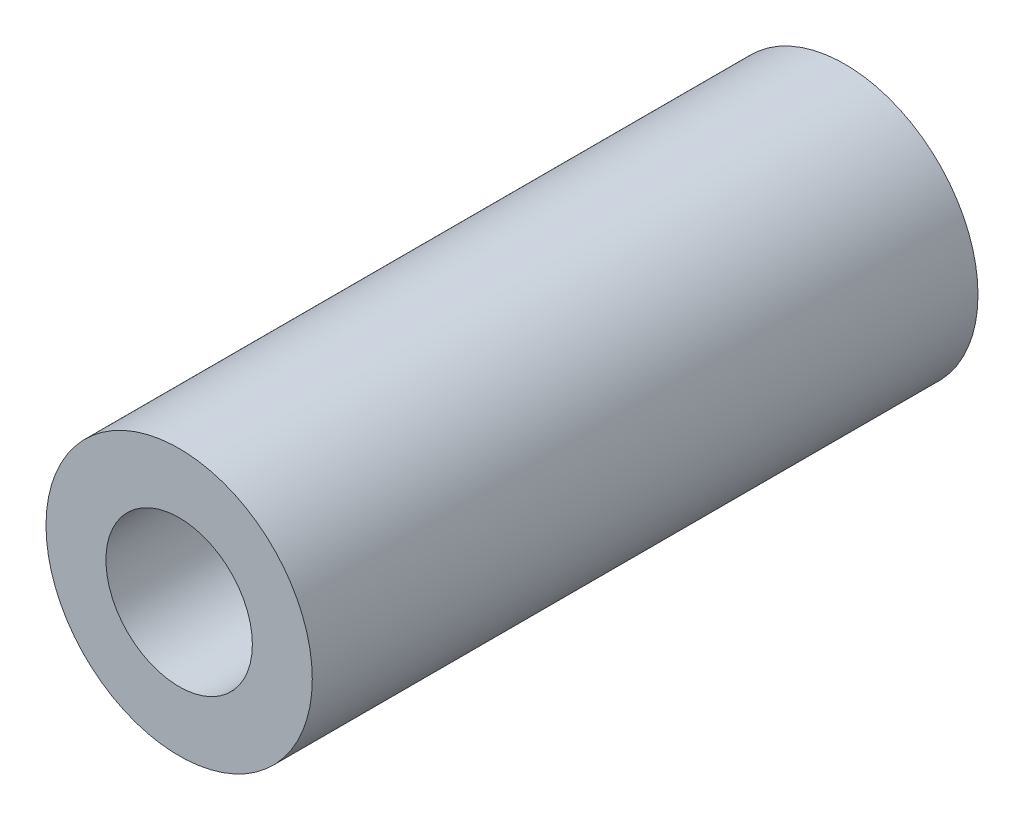
ISO-10303-21;
HEADER;
FILE_DESCRIPTION(('STEP AP214'),'2;1');
FILE_NAME('part.step','',(''),(''),'','','');
FILE_SCHEMA(('AUTOMOTIVE_DESIGN { 1 0 10303 214 1 1 1 1 }'));
ENDSEC;
DATA;
#1=APPLICATION_CONTEXT('core data for automotive mechanical design processes');
#2=APPLICATION_PROTOCOL_DEFINITION('international standard','automotive_design',2000,#1);
#3=PRODUCT_CONTEXT('',#1,'mechanical');
#4=PRODUCT('Part','Part','',(#3));
#5=PRODUCT_RELATED_PRODUCT_CATEGORY('part','',(#4));
#6=PRODUCT_DEFINITION_FORMATION('','',#4);
#7=PRODUCT_DEFINITION_CONTEXT('part definition',#1,'design');
#8=PRODUCT_DEFINITION('design','',#6,#7);
#9=PRODUCT_DEFINITION_SHAPE('','',#8);
#10=(LENGTH_UNIT() NAMED_UNIT(*) SI_UNIT(.MILLI.,.METRE.));
#11=(NAMED_UNIT(*) PLANE_ANGLE_UNIT() SI_UNIT($,.RADIAN.));
#12=(NAMED_UNIT(*) SI_UNIT($,.STERADIAN.) SOLID_ANGLE_UNIT());
#13=UNCERTAINTY_MEASURE_WITH_UNIT(LENGTH_MEASURE(1.E-05),#10,'distance_accuracy_value','');
#14=(GEOMETRIC_REPRESENTATION_CONTEXT(3) GLOBAL_UNCERTAINTY_ASSIGNED_CONTEXT((#13)) GLOBAL_UNIT_ASSIGNED_CONTEXT((#10,
#11,#12)) REPRESENTATION_CONTEXT('',''));
#15=CARTESIAN_POINT('',(0.,0.,0.));
#16=DIRECTION('',(0.,0.,1.));
#17=DIRECTION('',(1.,0.,0.));
#18=AXIS2_PLACEMENT_3D('',#15,#16,#17);
#19=CARTESIAN_POINT('',(0.,0.,10.));
#20=DIRECTION('',(0.,0.,1.));
#21=DIRECTION('',(1.,0.,0.));
#22=AXIS2_PLACEMENT_3D('',#19,#20,#21);
#23=PLANE('',#22);
#24=CARTESIAN_POINT('',(0.,0.,10.));
#25=DIRECTION('',(0.,0.,1.));
#26=DIRECTION('',(1.,0.,0.));
#27=AXIS2_PLACEMENT_3D('',#24,#25,#26);
#28=CIRCLE('',#27,2.);
#29=CARTESIAN_POINT('',(2.,0.,10.));
#30=VERTEX_POINT('',#29);
#31=EDGE_CURVE('E10',#30,#30,#28,.T.);
#32=ORIENTED_EDGE('',*,*,#31,.T.);
#33=EDGE_LOOP('',(#32));
#34=FACE_BOUND('',#33,.T.);
#35=CARTESIAN_POINT('',(0.,0.,10.));
#36=DIRECTION('',(0.,0.,1.));
#37=DIRECTION('',(1.,0.,0.));
#38=AXIS2_PLACEMENT_3D('',#35,#36,#37);
#39=CIRCLE('',#38,1.1);
#40=CARTESIAN_POINT('',(1.1,0.,10.));
#41=VERTEX_POINT('',#40);
#42=EDGE_CURVE('E48',#41,#41,#39,.T.);
#43=ORIENTED_EDGE('',*,*,#42,.F.);
#44=EDGE_LOOP('',(#43));
#45=FACE_BOUND('',#44,.T.);
#46=ADVANCED_FACE('F37',(#34,#45),#23,.T.);
#47=CARTESIAN_POINT('',(0.,0.,0.));
#48=DIRECTION('',(0.,0.,1.));
#49=DIRECTION('',(1.,0.,0.));
#50=AXIS2_PLACEMENT_3D('',#47,#48,#49);
#51=PLANE('',#50);
#52=CARTESIAN_POINT('',(0.,0.,0.));
#53=DIRECTION('',(0.,0.,1.));
#54=DIRECTION('',(1.,0.,0.));
#55=AXIS2_PLACEMENT_3D('',#52,#53,#54);
#56=CIRCLE('',#55,2.);
#57=CARTESIAN_POINT('',(2.,0.,0.));
#58=VERTEX_POINT('',#57);
#59=EDGE_CURVE('E41',#58,#58,#56,.T.);
#60=ORIENTED_EDGE('',*,*,#59,.F.);
#61=EDGE_LOOP('',(#60));
#62=FACE_BOUND('',#61,.T.);
#63=CARTESIAN_POINT('',(0.,0.,0.));
#64=DIRECTION('',(0.,0.,1.));
#65=DIRECTION('',(1.,0.,0.));
#66=AXIS2_PLACEMENT_3D('',#63,#64,#65);
#67=CIRCLE('',#66,1.1);
#68=CARTESIAN_POINT('',(1.1,0.,0.));
#69=VERTEX_POINT('',#68);
#70=EDGE_CURVE('E50',#69,#69,#67,.T.);
#71=ORIENTED_EDGE('',*,*,#70,.T.);
#72=EDGE_LOOP('',(#71));
#73=FACE_BOUND('',#72,.T.);
#74=ADVANCED_FACE('F60',(#62,#73),#51,.F.);
#75=CARTESIAN_POINT('',(0.,0.,10.));
#76=DIRECTION('',(0.,0.,-1.));
#77=DIRECTION('',(-1.,0.,0.));
#78=AXIS2_PLACEMENT_3D('',#75,#76,#77);
#79=CYLINDRICAL_SURFACE('',#78,2.);
#80=ORIENTED_EDGE('',*,*,#31,.F.);
#81=EDGE_LOOP('',(#80));
#82=FACE_BOUND('',#81,.T.);
#83=ORIENTED_EDGE('',*,*,#59,.T.);
#84=EDGE_LOOP('',(#83));
#85=FACE_BOUND('',#84,.T.);
#86=ADVANCED_FACE('F39',(#82,#85),#79,.T.);
#87=CARTESIAN_POINT('',(0.,0.,10.));
#88=DIRECTION('',(0.,0.,-1.));
#89=DIRECTION('',(-1.,0.,0.));
#90=AXIS2_PLACEMENT_3D('',#87,#88,#89);
#91=CYLINDRICAL_SURFACE('',#90,1.1);
#92=ORIENTED_EDGE('',*,*,#42,.T.);
#93=EDGE_LOOP('',(#92));
#94=FACE_BOUND('',#93,.T.);
#95=ORIENTED_EDGE('',*,*,#70,.F.);
#96=EDGE_LOOP('',(#95));
#97=FACE_BOUND('',#96,.T.);
#98=ADVANCED_FACE('F56',(#94,#97),#91,.F.);
#99=CLOSED_SHELL('',(#46,#74,#86,#98));
#100=MANIFOLD_SOLID_BREP('B2',#99);
#101=ADVANCED_BREP_SHAPE_REPRESENTATION('',(#18,#100),#14);
#102=SHAPE_DEFINITION_REPRESENTATION(#9,#101);
ENDSEC;
END-ISO-10303-21;
